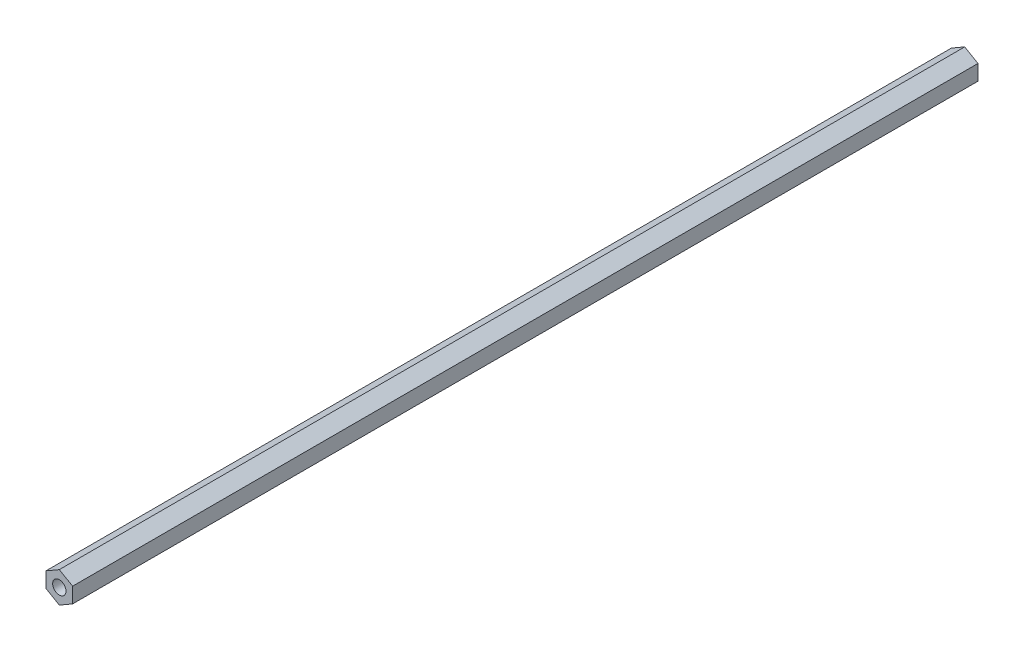
ISO-10303-21;
HEADER;
FILE_DESCRIPTION(('STEP AP214'),'2;1');
FILE_NAME('part.step','',(''),(''),'','','');
FILE_SCHEMA(('AUTOMOTIVE_DESIGN { 1 0 10303 214 1 1 1 1 }'));
ENDSEC;
DATA;
#1=APPLICATION_CONTEXT('core data for automotive mechanical design processes');
#2=APPLICATION_PROTOCOL_DEFINITION('international standard','automotive_design',2000,#1);
#3=PRODUCT_CONTEXT('',#1,'mechanical');
#4=PRODUCT('Part','Part','',(#3));
#5=PRODUCT_RELATED_PRODUCT_CATEGORY('part','',(#4));
#6=PRODUCT_DEFINITION_FORMATION('','',#4);
#7=PRODUCT_DEFINITION_CONTEXT('part definition',#1,'design');
#8=PRODUCT_DEFINITION('design','',#6,#7);
#9=PRODUCT_DEFINITION_SHAPE('','',#8);
#10=(LENGTH_UNIT() NAMED_UNIT(*) SI_UNIT(.MILLI.,.METRE.));
#11=(NAMED_UNIT(*) PLANE_ANGLE_UNIT() SI_UNIT($,.RADIAN.));
#12=(NAMED_UNIT(*) SI_UNIT($,.STERADIAN.) SOLID_ANGLE_UNIT());
#13=UNCERTAINTY_MEASURE_WITH_UNIT(LENGTH_MEASURE(1.E-05),#10,'distance_accuracy_value','');
#14=(GEOMETRIC_REPRESENTATION_CONTEXT(3) GLOBAL_UNCERTAINTY_ASSIGNED_CONTEXT((#13)) GLOBAL_UNIT_ASSIGNED_CONTEXT((#10,
#11,#12)) REPRESENTATION_CONTEXT('',''));
#15=CARTESIAN_POINT('',(0.,0.,0.));
#16=DIRECTION('',(0.,0.,1.));
#17=DIRECTION('',(1.,0.,0.));
#18=AXIS2_PLACEMENT_3D('',#15,#16,#17);
#19=CARTESIAN_POINT('',(-6.35,3.66617420935411,216.026998984));
#20=DIRECTION('',(1.,0.,0.));
#21=DIRECTION('',(0.,0.,-1.));
#22=AXIS2_PLACEMENT_3D('',#19,#20,#21);
#23=PLANE('',#22);
#24=DIRECTION('',(0.,0.,-1.));
#25=VECTOR('',#24,1.);
#26=CARTESIAN_POINT('',(-6.35,3.66617420935411,216.026998984));
#27=LINE('',#26,#25);
#28=CARTESIAN_POINT('',(-6.35,3.66617420935411,216.026998984));
#29=VERTEX_POINT('',#28);
#30=CARTESIAN_POINT('',(-6.35,3.66617420935411,-216.026998984));
#31=VERTEX_POINT('',#30);
#32=EDGE_CURVE('E141',#29,#31,#27,.T.);
#33=ORIENTED_EDGE('',*,*,#32,.T.);
#34=DIRECTION('',(0.,-1.,0.));
#35=VECTOR('',#34,1.);
#36=CARTESIAN_POINT('',(-6.35,3.66617420935411,-216.026998984));
#37=LINE('',#36,#35);
#38=CARTESIAN_POINT('',(-6.35,-3.66617420935413,-216.026998984));
#39=VERTEX_POINT('',#38);
#40=EDGE_CURVE('E113',#31,#39,#37,.T.);
#41=ORIENTED_EDGE('',*,*,#40,.T.);
#42=DIRECTION('',(0.,0.,-1.));
#43=VECTOR('',#42,1.);
#44=CARTESIAN_POINT('',(-6.35,-3.66617420935413,216.026998984));
#45=LINE('',#44,#43);
#46=CARTESIAN_POINT('',(-6.35,-3.66617420935413,216.026998984));
#47=VERTEX_POINT('',#46);
#48=EDGE_CURVE('E11',#47,#39,#45,.T.);
#49=ORIENTED_EDGE('',*,*,#48,.F.);
#50=DIRECTION('',(0.,-1.,0.));
#51=VECTOR('',#50,1.);
#52=CARTESIAN_POINT('',(-6.35,3.66617420935411,216.026998984));
#53=LINE('',#52,#51);
#54=EDGE_CURVE('E131',#29,#47,#53,.T.);
#55=ORIENTED_EDGE('',*,*,#54,.F.);
#56=EDGE_LOOP('',(#33,#41,#49,#55));
#57=FACE_BOUND('',#56,.T.);
#58=ADVANCED_FACE('F37',(#57),#23,.F.);
#59=CARTESIAN_POINT('',(-6.35,-3.66617420935413,216.026998984));
#60=DIRECTION('',(0.5,0.866025403784439,0.));
#61=DIRECTION('',(-0.866025403784439,0.5,0.));
#62=AXIS2_PLACEMENT_3D('',#59,#60,#61);
#63=PLANE('',#62);
#64=ORIENTED_EDGE('',*,*,#48,.T.);
#65=DIRECTION('',(0.866025403784439,-0.5,0.));
#66=VECTOR('',#65,1.);
#67=CARTESIAN_POINT('',(-6.35,-3.66617420935413,-216.026998984));
#68=LINE('',#67,#66);
#69=CARTESIAN_POINT('',(0.,-7.33234841870826,-216.026998984));
#70=VERTEX_POINT('',#69);
#71=EDGE_CURVE('E116',#39,#70,#68,.T.);
#72=ORIENTED_EDGE('',*,*,#71,.T.);
#73=DIRECTION('',(0.,0.,-1.));
#74=VECTOR('',#73,1.);
#75=CARTESIAN_POINT('',(0.,-7.33234841870826,216.026998984));
#76=LINE('',#75,#74);
#77=CARTESIAN_POINT('',(0.,-7.33234841870826,216.026998984));
#78=VERTEX_POINT('',#77);
#79=EDGE_CURVE('E44',#78,#70,#76,.T.);
#80=ORIENTED_EDGE('',*,*,#79,.F.);
#81=DIRECTION('',(0.866025403784439,-0.5,0.));
#82=VECTOR('',#81,1.);
#83=CARTESIAN_POINT('',(-6.35,-3.66617420935413,216.026998984));
#84=LINE('',#83,#82);
#85=EDGE_CURVE('E133',#47,#78,#84,.T.);
#86=ORIENTED_EDGE('',*,*,#85,.F.);
#87=EDGE_LOOP('',(#64,#72,#80,#86));
#88=FACE_BOUND('',#87,.T.);
#89=ADVANCED_FACE('F161',(#88),#63,.F.);
#90=CARTESIAN_POINT('',(0.,-7.33234841870826,216.026998984));
#91=DIRECTION('',(-0.5,0.866025403784439,0.));
#92=DIRECTION('',(-0.866025403784439,-0.5,0.));
#93=AXIS2_PLACEMENT_3D('',#90,#91,#92);
#94=PLANE('',#93);
#95=ORIENTED_EDGE('',*,*,#79,.T.);
#96=DIRECTION('',(0.866025403784439,0.5,0.));
#97=VECTOR('',#96,1.);
#98=CARTESIAN_POINT('',(0.,-7.33234841870826,-216.026998984));
#99=LINE('',#98,#97);
#100=CARTESIAN_POINT('',(6.35,-3.66617420935414,-216.026998984));
#101=VERTEX_POINT('',#100);
#102=EDGE_CURVE('E119',#70,#101,#99,.T.);
#103=ORIENTED_EDGE('',*,*,#102,.T.);
#104=DIRECTION('',(0.,0.,-1.));
#105=VECTOR('',#104,1.);
#106=CARTESIAN_POINT('',(6.35,-3.66617420935414,216.026998984));
#107=LINE('',#106,#105);
#108=CARTESIAN_POINT('',(6.35,-3.66617420935414,216.026998984));
#109=VERTEX_POINT('',#108);
#110=EDGE_CURVE('E147',#109,#101,#107,.T.);
#111=ORIENTED_EDGE('',*,*,#110,.F.);
#112=DIRECTION('',(0.866025403784439,0.5,0.));
#113=VECTOR('',#112,1.);
#114=CARTESIAN_POINT('',(0.,-7.33234841870826,216.026998984));
#115=LINE('',#114,#113);
#116=EDGE_CURVE('E135',#78,#109,#115,.T.);
#117=ORIENTED_EDGE('',*,*,#116,.F.);
#118=EDGE_LOOP('',(#95,#103,#111,#117));
#119=FACE_BOUND('',#118,.T.);
#120=ADVANCED_FACE('F152',(#119),#94,.F.);
#121=CARTESIAN_POINT('',(6.35,-3.66617420935414,216.026998984));
#122=DIRECTION('',(-1.,0.,0.));
#123=DIRECTION('',(0.,-1.,0.));
#124=AXIS2_PLACEMENT_3D('',#121,#122,#123);
#125=PLANE('',#124);
#126=ORIENTED_EDGE('',*,*,#110,.T.);
#127=DIRECTION('',(0.,1.,0.));
#128=VECTOR('',#127,1.);
#129=CARTESIAN_POINT('',(6.35,-3.66617420935414,-216.026998984));
#130=LINE('',#129,#128);
#131=CARTESIAN_POINT('',(6.35,3.66617420935412,-216.026998984));
#132=VERTEX_POINT('',#131);
#133=EDGE_CURVE('E122',#101,#132,#130,.T.);
#134=ORIENTED_EDGE('',*,*,#133,.T.);
#135=DIRECTION('',(0.,0.,-1.));
#136=VECTOR('',#135,1.);
#137=CARTESIAN_POINT('',(6.35,3.66617420935412,216.026998984));
#138=LINE('',#137,#136);
#139=CARTESIAN_POINT('',(6.35,3.66617420935412,216.026998984));
#140=VERTEX_POINT('',#139);
#141=EDGE_CURVE('E145',#140,#132,#138,.T.);
#142=ORIENTED_EDGE('',*,*,#141,.F.);
#143=DIRECTION('',(0.,1.,0.));
#144=VECTOR('',#143,1.);
#145=CARTESIAN_POINT('',(6.35,-3.66617420935414,216.026998984));
#146=LINE('',#145,#144);
#147=EDGE_CURVE('E137',#109,#140,#146,.T.);
#148=ORIENTED_EDGE('',*,*,#147,.F.);
#149=EDGE_LOOP('',(#126,#134,#142,#148));
#150=FACE_BOUND('',#149,.T.);
#151=ADVANCED_FACE('F172',(#150),#125,.F.);
#152=CARTESIAN_POINT('',(6.35,3.66617420935412,216.026998984));
#153=DIRECTION('',(-0.5,-0.866025403784439,0.));
#154=DIRECTION('',(0.866025403784438,-0.5,0.));
#155=AXIS2_PLACEMENT_3D('',#152,#153,#154);
#156=PLANE('',#155);
#157=ORIENTED_EDGE('',*,*,#141,.T.);
#158=DIRECTION('',(-0.866025403784439,0.5,0.));
#159=VECTOR('',#158,1.);
#160=CARTESIAN_POINT('',(6.35,3.66617420935412,-216.026998984));
#161=LINE('',#160,#159);
#162=CARTESIAN_POINT('',(0.,7.33234841870824,-216.026998984));
#163=VERTEX_POINT('',#162);
#164=EDGE_CURVE('E125',#132,#163,#161,.T.);
#165=ORIENTED_EDGE('',*,*,#164,.T.);
#166=DIRECTION('',(0.,0.,-1.));
#167=VECTOR('',#166,1.);
#168=CARTESIAN_POINT('',(0.,7.33234841870824,216.026998984));
#169=LINE('',#168,#167);
#170=CARTESIAN_POINT('',(0.,7.33234841870824,216.026998984));
#171=VERTEX_POINT('',#170);
#172=EDGE_CURVE('E143',#171,#163,#169,.T.);
#173=ORIENTED_EDGE('',*,*,#172,.F.);
#174=DIRECTION('',(-0.866025403784439,0.5,0.));
#175=VECTOR('',#174,1.);
#176=CARTESIAN_POINT('',(6.35,3.66617420935412,216.026998984));
#177=LINE('',#176,#175);
#178=EDGE_CURVE('E56',#140,#171,#177,.T.);
#179=ORIENTED_EDGE('',*,*,#178,.F.);
#180=EDGE_LOOP('',(#157,#165,#173,#179));
#181=FACE_BOUND('',#180,.T.);
#182=ADVANCED_FACE('F169',(#181),#156,.F.);
#183=CARTESIAN_POINT('',(0.,7.33234841870824,216.026998984));
#184=DIRECTION('',(0.5,-0.866025403784439,0.));
#185=DIRECTION('',(0.866025403784439,0.5,0.));
#186=AXIS2_PLACEMENT_3D('',#183,#184,#185);
#187=PLANE('',#186);
#188=ORIENTED_EDGE('',*,*,#172,.T.);
#189=DIRECTION('',(-0.866025403784439,-0.5,0.));
#190=VECTOR('',#189,1.);
#191=CARTESIAN_POINT('',(0.,7.33234841870824,-216.026998984));
#192=LINE('',#191,#190);
#193=EDGE_CURVE('E128',#163,#31,#192,.T.);
#194=ORIENTED_EDGE('',*,*,#193,.T.);
#195=ORIENTED_EDGE('',*,*,#32,.F.);
#196=DIRECTION('',(-0.866025403784439,-0.5,0.));
#197=VECTOR('',#196,1.);
#198=CARTESIAN_POINT('',(0.,7.33234841870824,216.026998984));
#199=LINE('',#198,#197);
#200=EDGE_CURVE('E51',#171,#29,#199,.T.);
#201=ORIENTED_EDGE('',*,*,#200,.F.);
#202=EDGE_LOOP('',(#188,#194,#195,#201));
#203=FACE_BOUND('',#202,.T.);
#204=ADVANCED_FACE('F167',(#203),#187,.F.);
#205=CARTESIAN_POINT('',(0.,0.,216.026998984));
#206=DIRECTION('',(0.,0.,1.));
#207=DIRECTION('',(1.,0.,0.));
#208=AXIS2_PLACEMENT_3D('',#205,#206,#207);
#209=PLANE('',#208);
#210=CARTESIAN_POINT('',(0.,0.,216.026998984));
#211=DIRECTION('',(0.,0.,1.));
#212=DIRECTION('',(1.,0.,0.));
#213=AXIS2_PLACEMENT_3D('',#210,#211,#212);
#214=CIRCLE('',#213,3.17499999999999);
#215=CARTESIAN_POINT('',(3.17499999999999,0.,216.026998984));
#216=VERTEX_POINT('',#215);
#217=EDGE_CURVE('E102',#216,#216,#214,.T.);
#218=ORIENTED_EDGE('',*,*,#217,.F.);
#219=EDGE_LOOP('',(#218));
#220=FACE_BOUND('',#219,.T.);
#221=ORIENTED_EDGE('',*,*,#54,.T.);
#222=ORIENTED_EDGE('',*,*,#85,.T.);
#223=ORIENTED_EDGE('',*,*,#116,.T.);
#224=ORIENTED_EDGE('',*,*,#147,.T.);
#225=ORIENTED_EDGE('',*,*,#178,.T.);
#226=ORIENTED_EDGE('',*,*,#200,.T.);
#227=EDGE_LOOP('',(#221,#222,#223,#224,#225,#226));
#228=FACE_BOUND('',#227,.T.);
#229=ADVANCED_FACE('F174',(#220,#228),#209,.T.);
#230=CARTESIAN_POINT('',(0.,0.,-216.026998984));
#231=DIRECTION('',(0.,0.,1.));
#232=DIRECTION('',(1.,0.,0.));
#233=AXIS2_PLACEMENT_3D('',#230,#231,#232);
#234=PLANE('',#233);
#235=CARTESIAN_POINT('',(0.,0.,-216.026998984));
#236=DIRECTION('',(0.,0.,-1.));
#237=DIRECTION('',(-1.,0.,0.));
#238=AXIS2_PLACEMENT_3D('',#235,#236,#237);
#239=CIRCLE('',#238,3.17499999999999);
#240=CARTESIAN_POINT('',(-3.17499999999999,0.,-216.026998984));
#241=VERTEX_POINT('',#240);
#242=EDGE_CURVE('E103',#241,#241,#239,.T.);
#243=ORIENTED_EDGE('',*,*,#242,.F.);
#244=EDGE_LOOP('',(#243));
#245=FACE_BOUND('',#244,.T.);
#246=ORIENTED_EDGE('',*,*,#40,.F.);
#247=ORIENTED_EDGE('',*,*,#193,.F.);
#248=ORIENTED_EDGE('',*,*,#164,.F.);
#249=ORIENTED_EDGE('',*,*,#133,.F.);
#250=ORIENTED_EDGE('',*,*,#102,.F.);
#251=ORIENTED_EDGE('',*,*,#71,.F.);
#252=EDGE_LOOP('',(#246,#247,#248,#249,#250,#251));
#253=FACE_BOUND('',#252,.T.);
#254=ADVANCED_FACE('F159',(#245,#253),#234,.F.);
#255=CARTESIAN_POINT('',(0.,0.,190.626998984));
#256=DIRECTION('',(0.,0.,1.));
#257=DIRECTION('',(1.,0.,0.));
#258=AXIS2_PLACEMENT_3D('',#255,#256,#257);
#259=CONICAL_SURFACE('',#258,3.17499999999995,1.02974425867665);
#260=CARTESIAN_POINT('',(0.,0.,188.719266518588));
#261=VERTEX_POINT('',#260);
#262=VERTEX_LOOP('',#261);
#263=FACE_BOUND('',#262,.T.);
#264=CARTESIAN_POINT('',(0.,0.,190.626998984));
#265=DIRECTION('',(0.,0.,1.));
#266=DIRECTION('',(1.,0.,0.));
#267=AXIS2_PLACEMENT_3D('',#264,#265,#266);
#268=CIRCLE('',#267,3.17499999999995);
#269=CARTESIAN_POINT('',(3.17499999999995,0.,190.626998984));
#270=VERTEX_POINT('',#269);
#271=EDGE_CURVE('E106',#270,#270,#268,.T.);
#272=ORIENTED_EDGE('',*,*,#271,.T.);
#273=EDGE_LOOP('',(#272));
#274=FACE_BOUND('',#273,.T.);
#275=ADVANCED_FACE('F182',(#263,#274),#259,.F.);
#276=CARTESIAN_POINT('',(0.,0.,216.026998984));
#277=DIRECTION('',(0.,0.,1.));
#278=DIRECTION('',(1.,0.,0.));
#279=AXIS2_PLACEMENT_3D('',#276,#277,#278);
#280=CYLINDRICAL_SURFACE('',#279,3.17499999999997);
#281=ORIENTED_EDGE('',*,*,#271,.F.);
#282=EDGE_LOOP('',(#281));
#283=FACE_BOUND('',#282,.T.);
#284=ORIENTED_EDGE('',*,*,#217,.T.);
#285=EDGE_LOOP('',(#284));
#286=FACE_BOUND('',#285,.T.);
#287=ADVANCED_FACE('F96',(#283,#286),#280,.F.);
#288=CARTESIAN_POINT('',(0.,0.,-190.626998984));
#289=DIRECTION('',(0.,0.,-1.));
#290=DIRECTION('',(-1.,0.,0.));
#291=AXIS2_PLACEMENT_3D('',#288,#289,#290);
#292=CONICAL_SURFACE('',#291,3.17499999999995,1.02974425867665);
#293=CARTESIAN_POINT('',(0.,0.,-188.719266518588));
#294=VERTEX_POINT('',#293);
#295=VERTEX_LOOP('',#294);
#296=FACE_BOUND('',#295,.T.);
#297=CARTESIAN_POINT('',(0.,0.,-190.626998984));
#298=DIRECTION('',(0.,0.,-1.));
#299=DIRECTION('',(-1.,0.,0.));
#300=AXIS2_PLACEMENT_3D('',#297,#298,#299);
#301=CIRCLE('',#300,3.17499999999995);
#302=CARTESIAN_POINT('',(-3.17499999999995,0.,-190.626998984));
#303=VERTEX_POINT('',#302);
#304=EDGE_CURVE('E100',#303,#303,#301,.T.);
#305=ORIENTED_EDGE('',*,*,#304,.T.);
#306=EDGE_LOOP('',(#305));
#307=FACE_BOUND('',#306,.T.);
#308=ADVANCED_FACE('F92',(#296,#307),#292,.F.);
#309=CARTESIAN_POINT('',(0.,0.,-216.026998984));
#310=DIRECTION('',(0.,0.,-1.));
#311=DIRECTION('',(-1.,0.,0.));
#312=AXIS2_PLACEMENT_3D('',#309,#310,#311);
#313=CYLINDRICAL_SURFACE('',#312,3.17499999999997);
#314=ORIENTED_EDGE('',*,*,#304,.F.);
#315=EDGE_LOOP('',(#314));
#316=FACE_BOUND('',#315,.T.);
#317=ORIENTED_EDGE('',*,*,#242,.T.);
#318=EDGE_LOOP('',(#317));
#319=FACE_BOUND('',#318,.T.);
#320=ADVANCED_FACE('F95',(#316,#319),#313,.F.);
#321=CLOSED_SHELL('',(#58,#89,#120,#151,#182,#204,#229,#254,#275,#287,#308,#320));
#322=MANIFOLD_SOLID_BREP('B2',#321);
#323=ADVANCED_BREP_SHAPE_REPRESENTATION('',(#18,#322),#14);
#324=SHAPE_DEFINITION_REPRESENTATION(#9,#323);
ENDSEC;
END-ISO-10303-21;
